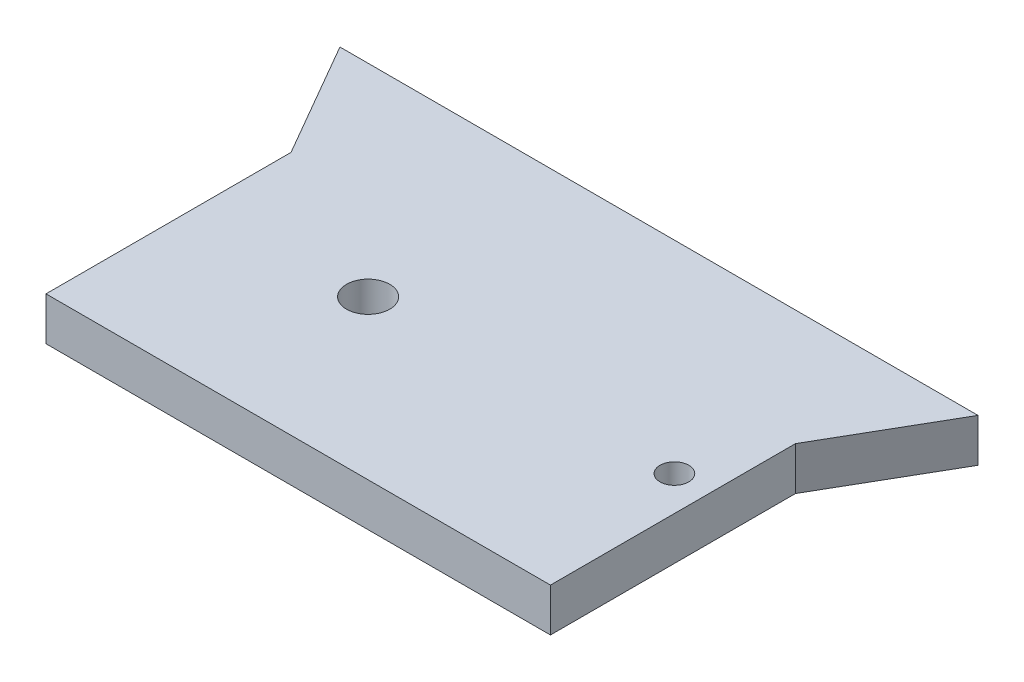
ISO-10303-21;
HEADER;
FILE_DESCRIPTION(('STEP AP214'),'2;1');
FILE_NAME('part.step','',(''),(''),'','','');
FILE_SCHEMA(('AUTOMOTIVE_DESIGN { 1 0 10303 214 1 1 1 1 }'));
ENDSEC;
DATA;
#1=APPLICATION_CONTEXT('core data for automotive mechanical design processes');
#2=APPLICATION_PROTOCOL_DEFINITION('international standard','automotive_design',2000,#1);
#3=PRODUCT_CONTEXT('',#1,'mechanical');
#4=PRODUCT('Part','Part','',(#3));
#5=PRODUCT_RELATED_PRODUCT_CATEGORY('part','',(#4));
#6=PRODUCT_DEFINITION_FORMATION('','',#4);
#7=PRODUCT_DEFINITION_CONTEXT('part definition',#1,'design');
#8=PRODUCT_DEFINITION('design','',#6,#7);
#9=PRODUCT_DEFINITION_SHAPE('','',#8);
#10=(LENGTH_UNIT() NAMED_UNIT(*) SI_UNIT(.MILLI.,.METRE.));
#11=(NAMED_UNIT(*) PLANE_ANGLE_UNIT() SI_UNIT($,.RADIAN.));
#12=(NAMED_UNIT(*) SI_UNIT($,.STERADIAN.) SOLID_ANGLE_UNIT());
#13=UNCERTAINTY_MEASURE_WITH_UNIT(LENGTH_MEASURE(1.E-05),#10,'distance_accuracy_value','');
#14=(GEOMETRIC_REPRESENTATION_CONTEXT(3) GLOBAL_UNCERTAINTY_ASSIGNED_CONTEXT((#13)) GLOBAL_UNIT_ASSIGNED_CONTEXT((#10,
#11,#12)) REPRESENTATION_CONTEXT('',''));
#15=CARTESIAN_POINT('',(0.,0.,0.));
#16=DIRECTION('',(0.,0.,1.));
#17=DIRECTION('',(1.,0.,0.));
#18=AXIS2_PLACEMENT_3D('',#15,#16,#17);
#19=CARTESIAN_POINT('',(0.,3.,0.));
#20=DIRECTION('',(0.,1.,0.));
#21=DIRECTION('',(0.,0.,1.));
#22=AXIS2_PLACEMENT_3D('',#19,#20,#21);
#23=PLANE('',#22);
#24=CARTESIAN_POINT('',(3.76174763772241,3.,-3.21144670958168));
#25=DIRECTION('',(0.,1.,0.));
#26=DIRECTION('',(0.,0.,1.));
#27=AXIS2_PLACEMENT_3D('',#24,#25,#26);
#28=CIRCLE('',#27,1.);
#29=CARTESIAN_POINT('',(3.76174763772241,3.,-2.21144670958168));
#30=VERTEX_POINT('',#29);
#31=EDGE_CURVE('E124',#30,#30,#28,.T.);
#32=ORIENTED_EDGE('',*,*,#31,.F.);
#33=EDGE_LOOP('',(#32));
#34=FACE_BOUND('',#33,.T.);
#35=DIRECTION('',(0.500000000000002,0.,0.866025403784438));
#36=VECTOR('',#35,1.);
#37=CARTESIAN_POINT('',(-33.4735660475953,3.,-17.2400455215712));
#38=LINE('',#37,#36);
#39=CARTESIAN_POINT('',(-33.4735660475953,3.,-17.2400455215712));
#40=VERTEX_POINT('',#39);
#41=CARTESIAN_POINT('',(-28.8382523622776,3.,-9.21144670958166));
#42=VERTEX_POINT('',#41);
#43=EDGE_CURVE('E131',#40,#42,#38,.T.);
#44=ORIENTED_EDGE('',*,*,#43,.T.);
#45=DIRECTION('',(0.,0.,1.));
#46=VECTOR('',#45,1.);
#47=CARTESIAN_POINT('',(-28.8382523622776,3.,-9.21144670958166));
#48=LINE('',#47,#46);
#49=CARTESIAN_POINT('',(-28.8382523622776,3.,7.78855329041833));
#50=VERTEX_POINT('',#49);
#51=EDGE_CURVE('E89',#42,#50,#48,.T.);
#52=ORIENTED_EDGE('',*,*,#51,.T.);
#53=DIRECTION('',(1.,0.,0.));
#54=VECTOR('',#53,1.);
#55=CARTESIAN_POINT('',(-28.8382523622776,3.,7.78855329041833));
#56=LINE('',#55,#54);
#57=CARTESIAN_POINT('',(6.16174763772241,3.,7.78855329041833));
#58=VERTEX_POINT('',#57);
#59=EDGE_CURVE('E102',#50,#58,#56,.T.);
#60=ORIENTED_EDGE('',*,*,#59,.T.);
#61=DIRECTION('',(0.,0.,-1.));
#62=VECTOR('',#61,1.);
#63=CARTESIAN_POINT('',(6.16174763772241,3.,7.78855329041833));
#64=LINE('',#63,#62);
#65=CARTESIAN_POINT('',(6.16174763772241,3.,-9.21144670958166));
#66=VERTEX_POINT('',#65);
#67=EDGE_CURVE('E96',#58,#66,#64,.T.);
#68=ORIENTED_EDGE('',*,*,#67,.T.);
#69=DIRECTION('',(0.500000000000001,0.,-0.866025403784438));
#70=VECTOR('',#69,1.);
#71=CARTESIAN_POINT('',(6.16174763772241,3.,-9.21144670958166));
#72=LINE('',#71,#70);
#73=CARTESIAN_POINT('',(10.7970613230401,3.,-17.2400455215712));
#74=VERTEX_POINT('',#73);
#75=EDGE_CURVE('E100',#66,#74,#72,.T.);
#76=ORIENTED_EDGE('',*,*,#75,.T.);
#77=DIRECTION('',(-1.,0.,0.));
#78=VECTOR('',#77,1.);
#79=CARTESIAN_POINT('',(10.7970613230401,3.,-17.2400455215712));
#80=LINE('',#79,#78);
#81=EDGE_CURVE('E52',#74,#40,#80,.T.);
#82=ORIENTED_EDGE('',*,*,#81,.T.);
#83=EDGE_LOOP('',(#44,#52,#60,#68,#76,#82));
#84=FACE_BOUND('',#83,.T.);
#85=CARTESIAN_POINT('',(-17.4882523622776,3.,-3.21144670958168));
#86=DIRECTION('',(0.,1.,0.));
#87=DIRECTION('',(0.,0.,1.));
#88=AXIS2_PLACEMENT_3D('',#85,#86,#87);
#89=CIRCLE('',#88,1.5);
#90=CARTESIAN_POINT('',(-17.4882523622776,3.,-1.71144670958168));
#91=VERTEX_POINT('',#90);
#92=EDGE_CURVE('E173',#91,#91,#89,.T.);
#93=ORIENTED_EDGE('',*,*,#92,.F.);
#94=EDGE_LOOP('',(#93));
#95=FACE_BOUND('',#94,.T.);
#96=ADVANCED_FACE('F35',(#34,#84,#95),#23,.T.);
#97=CARTESIAN_POINT('',(0.,0.,0.));
#98=DIRECTION('',(0.,1.,0.));
#99=DIRECTION('',(0.,0.,1.));
#100=AXIS2_PLACEMENT_3D('',#97,#98,#99);
#101=PLANE('',#100);
#102=DIRECTION('',(0.500000000000002,0.,0.866025403784438));
#103=VECTOR('',#102,1.);
#104=CARTESIAN_POINT('',(-33.4735660475953,0.,-17.2400455215712));
#105=LINE('',#104,#103);
#106=CARTESIAN_POINT('',(-33.4735660475953,0.,-17.2400455215712));
#107=VERTEX_POINT('',#106);
#108=CARTESIAN_POINT('',(-28.8382523622776,0.,-9.21144670958166));
#109=VERTEX_POINT('',#108);
#110=EDGE_CURVE('E120',#107,#109,#105,.T.);
#111=ORIENTED_EDGE('',*,*,#110,.F.);
#112=DIRECTION('',(-1.,0.,0.));
#113=VECTOR('',#112,1.);
#114=CARTESIAN_POINT('',(10.7970613230401,0.,-17.2400455215712));
#115=LINE('',#114,#113);
#116=CARTESIAN_POINT('',(10.7970613230401,0.,-17.2400455215712));
#117=VERTEX_POINT('',#116);
#118=EDGE_CURVE('E81',#117,#107,#115,.T.);
#119=ORIENTED_EDGE('',*,*,#118,.F.);
#120=DIRECTION('',(0.500000000000001,0.,-0.866025403784438));
#121=VECTOR('',#120,1.);
#122=CARTESIAN_POINT('',(6.16174763772241,0.,-9.21144670958166));
#123=LINE('',#122,#121);
#124=CARTESIAN_POINT('',(6.16174763772241,0.,-9.21144670958166));
#125=VERTEX_POINT('',#124);
#126=EDGE_CURVE('E75',#125,#117,#123,.T.);
#127=ORIENTED_EDGE('',*,*,#126,.F.);
#128=DIRECTION('',(0.,0.,-1.));
#129=VECTOR('',#128,1.);
#130=CARTESIAN_POINT('',(6.16174763772241,0.,7.78855329041833));
#131=LINE('',#130,#129);
#132=CARTESIAN_POINT('',(6.16174763772241,0.,7.78855329041833));
#133=VERTEX_POINT('',#132);
#134=EDGE_CURVE('E110',#133,#125,#131,.T.);
#135=ORIENTED_EDGE('',*,*,#134,.F.);
#136=DIRECTION('',(1.,0.,0.));
#137=VECTOR('',#136,1.);
#138=CARTESIAN_POINT('',(-28.8382523622776,0.,7.78855329041833));
#139=LINE('',#138,#137);
#140=CARTESIAN_POINT('',(-28.8382523622776,0.,7.78855329041833));
#141=VERTEX_POINT('',#140);
#142=EDGE_CURVE('E126',#141,#133,#139,.T.);
#143=ORIENTED_EDGE('',*,*,#142,.F.);
#144=DIRECTION('',(0.,0.,1.));
#145=VECTOR('',#144,1.);
#146=CARTESIAN_POINT('',(-28.8382523622776,0.,-9.21144670958166));
#147=LINE('',#146,#145);
#148=EDGE_CURVE('E123',#109,#141,#147,.T.);
#149=ORIENTED_EDGE('',*,*,#148,.F.);
#150=EDGE_LOOP('',(#111,#119,#127,#135,#143,#149));
#151=FACE_BOUND('',#150,.T.);
#152=CARTESIAN_POINT('',(3.76174763772241,0.,-3.21144670958168));
#153=DIRECTION('',(0.,1.,0.));
#154=DIRECTION('',(0.,0.,1.));
#155=AXIS2_PLACEMENT_3D('',#152,#153,#154);
#156=CIRCLE('',#155,1.);
#157=CARTESIAN_POINT('',(3.76174763772241,0.,-2.21144670958168));
#158=VERTEX_POINT('',#157);
#159=EDGE_CURVE('E179',#158,#158,#156,.T.);
#160=ORIENTED_EDGE('',*,*,#159,.T.);
#161=EDGE_LOOP('',(#160));
#162=FACE_BOUND('',#161,.T.);
#163=CARTESIAN_POINT('',(-17.4882523622776,0.,-3.21144670958168));
#164=DIRECTION('',(0.,1.,0.));
#165=DIRECTION('',(0.,0.,1.));
#166=AXIS2_PLACEMENT_3D('',#163,#164,#165);
#167=CIRCLE('',#166,1.5);
#168=CARTESIAN_POINT('',(-17.4882523622776,0.,-1.71144670958168));
#169=VERTEX_POINT('',#168);
#170=EDGE_CURVE('E176',#169,#169,#167,.T.);
#171=ORIENTED_EDGE('',*,*,#170,.T.);
#172=EDGE_LOOP('',(#171));
#173=FACE_BOUND('',#172,.T.);
#174=ADVANCED_FACE('F140',(#151,#162,#173),#101,.F.);
#175=CARTESIAN_POINT('',(-33.4735660475953,3.,-17.2400455215712));
#176=DIRECTION('',(0.866025403784438,0.,-0.500000000000002));
#177=DIRECTION('',(-0.500000000000002,0.,-0.866025403784438));
#178=AXIS2_PLACEMENT_3D('',#175,#176,#177);
#179=PLANE('',#178);
#180=ORIENTED_EDGE('',*,*,#110,.T.);
#181=DIRECTION('',(0.,-1.,0.));
#182=VECTOR('',#181,1.);
#183=CARTESIAN_POINT('',(-28.8382523622776,3.,-9.21144670958166));
#184=LINE('',#183,#182);
#185=EDGE_CURVE('E11',#42,#109,#184,.T.);
#186=ORIENTED_EDGE('',*,*,#185,.F.);
#187=ORIENTED_EDGE('',*,*,#43,.F.);
#188=DIRECTION('',(0.,-1.,0.));
#189=VECTOR('',#188,1.);
#190=CARTESIAN_POINT('',(-33.4735660475953,3.,-17.2400455215712));
#191=LINE('',#190,#189);
#192=EDGE_CURVE('E116',#40,#107,#191,.T.);
#193=ORIENTED_EDGE('',*,*,#192,.T.);
#194=EDGE_LOOP('',(#180,#186,#187,#193));
#195=FACE_BOUND('',#194,.T.);
#196=ADVANCED_FACE('F37',(#195),#179,.F.);
#197=CARTESIAN_POINT('',(-28.8382523622776,3.,-9.21144670958166));
#198=DIRECTION('',(1.,0.,0.));
#199=DIRECTION('',(0.,0.,-1.));
#200=AXIS2_PLACEMENT_3D('',#197,#198,#199);
#201=PLANE('',#200);
#202=ORIENTED_EDGE('',*,*,#148,.T.);
#203=DIRECTION('',(0.,-1.,0.));
#204=VECTOR('',#203,1.);
#205=CARTESIAN_POINT('',(-28.8382523622776,3.,7.78855329041833));
#206=LINE('',#205,#204);
#207=EDGE_CURVE('E44',#50,#141,#206,.T.);
#208=ORIENTED_EDGE('',*,*,#207,.F.);
#209=ORIENTED_EDGE('',*,*,#51,.F.);
#210=ORIENTED_EDGE('',*,*,#185,.T.);
#211=EDGE_LOOP('',(#202,#208,#209,#210));
#212=FACE_BOUND('',#211,.T.);
#213=ADVANCED_FACE('F220',(#212),#201,.F.);
#214=CARTESIAN_POINT('',(-28.8382523622776,3.,7.78855329041833));
#215=DIRECTION('',(0.,0.,-1.));
#216=DIRECTION('',(-1.,0.,0.));
#217=AXIS2_PLACEMENT_3D('',#214,#215,#216);
#218=PLANE('',#217);
#219=ORIENTED_EDGE('',*,*,#142,.T.);
#220=DIRECTION('',(0.,-1.,0.));
#221=VECTOR('',#220,1.);
#222=CARTESIAN_POINT('',(6.16174763772241,3.,7.78855329041833));
#223=LINE('',#222,#221);
#224=EDGE_CURVE('E111',#58,#133,#223,.T.);
#225=ORIENTED_EDGE('',*,*,#224,.F.);
#226=ORIENTED_EDGE('',*,*,#59,.F.);
#227=ORIENTED_EDGE('',*,*,#207,.T.);
#228=EDGE_LOOP('',(#219,#225,#226,#227));
#229=FACE_BOUND('',#228,.T.);
#230=ADVANCED_FACE('F137',(#229),#218,.F.);
#231=CARTESIAN_POINT('',(6.16174763772241,3.,7.78855329041833));
#232=DIRECTION('',(-1.,0.,0.));
#233=DIRECTION('',(0.,0.,1.));
#234=AXIS2_PLACEMENT_3D('',#231,#232,#233);
#235=PLANE('',#234);
#236=ORIENTED_EDGE('',*,*,#134,.T.);
#237=DIRECTION('',(0.,-1.,0.));
#238=VECTOR('',#237,1.);
#239=CARTESIAN_POINT('',(6.16174763772241,3.,-9.21144670958166));
#240=LINE('',#239,#238);
#241=EDGE_CURVE('E107',#66,#125,#240,.T.);
#242=ORIENTED_EDGE('',*,*,#241,.F.);
#243=ORIENTED_EDGE('',*,*,#67,.F.);
#244=ORIENTED_EDGE('',*,*,#224,.T.);
#245=EDGE_LOOP('',(#236,#242,#243,#244));
#246=FACE_BOUND('',#245,.T.);
#247=ADVANCED_FACE('F108',(#246),#235,.F.);
#248=CARTESIAN_POINT('',(6.16174763772241,3.,-9.21144670958166));
#249=DIRECTION('',(-0.866025403784438,0.,-0.500000000000001));
#250=DIRECTION('',(-0.500000000000001,0.,0.866025403784438));
#251=AXIS2_PLACEMENT_3D('',#248,#249,#250);
#252=PLANE('',#251);
#253=ORIENTED_EDGE('',*,*,#126,.T.);
#254=DIRECTION('',(0.,-1.,0.));
#255=VECTOR('',#254,1.);
#256=CARTESIAN_POINT('',(10.7970613230401,3.,-17.2400455215712));
#257=LINE('',#256,#255);
#258=EDGE_CURVE('E112',#74,#117,#257,.T.);
#259=ORIENTED_EDGE('',*,*,#258,.F.);
#260=ORIENTED_EDGE('',*,*,#75,.F.);
#261=ORIENTED_EDGE('',*,*,#241,.T.);
#262=EDGE_LOOP('',(#253,#259,#260,#261));
#263=FACE_BOUND('',#262,.T.);
#264=ADVANCED_FACE('F114',(#263),#252,.F.);
#265=CARTESIAN_POINT('',(10.7970613230401,3.,-17.2400455215712));
#266=DIRECTION('',(0.,0.,1.));
#267=DIRECTION('',(1.,0.,0.));
#268=AXIS2_PLACEMENT_3D('',#265,#266,#267);
#269=PLANE('',#268);
#270=ORIENTED_EDGE('',*,*,#118,.T.);
#271=ORIENTED_EDGE('',*,*,#192,.F.);
#272=ORIENTED_EDGE('',*,*,#81,.F.);
#273=ORIENTED_EDGE('',*,*,#258,.T.);
#274=EDGE_LOOP('',(#270,#271,#272,#273));
#275=FACE_BOUND('',#274,.T.);
#276=ADVANCED_FACE('F145',(#275),#269,.F.);
#277=CARTESIAN_POINT('',(3.76174763772241,3.,-3.21144670958168));
#278=DIRECTION('',(0.,-1.,0.));
#279=DIRECTION('',(0.,0.,-1.));
#280=AXIS2_PLACEMENT_3D('',#277,#278,#279);
#281=CYLINDRICAL_SURFACE('',#280,1.);
#282=ORIENTED_EDGE('',*,*,#31,.T.);
#283=EDGE_LOOP('',(#282));
#284=FACE_BOUND('',#283,.T.);
#285=ORIENTED_EDGE('',*,*,#159,.F.);
#286=EDGE_LOOP('',(#285));
#287=FACE_BOUND('',#286,.T.);
#288=ADVANCED_FACE('F147',(#284,#287),#281,.F.);
#289=CARTESIAN_POINT('',(-17.4882523622776,3.,-3.21144670958168));
#290=DIRECTION('',(0.,-1.,0.));
#291=DIRECTION('',(0.,0.,-1.));
#292=AXIS2_PLACEMENT_3D('',#289,#290,#291);
#293=CYLINDRICAL_SURFACE('',#292,1.5);
#294=ORIENTED_EDGE('',*,*,#92,.T.);
#295=EDGE_LOOP('',(#294));
#296=FACE_BOUND('',#295,.T.);
#297=ORIENTED_EDGE('',*,*,#170,.F.);
#298=EDGE_LOOP('',(#297));
#299=FACE_BOUND('',#298,.T.);
#300=ADVANCED_FACE('F153',(#296,#299),#293,.F.);
#301=CLOSED_SHELL('',(#96,#174,#196,#213,#230,#247,#264,#276,#288,#300));
#302=MANIFOLD_SOLID_BREP('B2',#301);
#303=ADVANCED_BREP_SHAPE_REPRESENTATION('',(#18,#302),#14);
#304=SHAPE_DEFINITION_REPRESENTATION(#9,#303);
ENDSEC;
END-ISO-10303-21;
